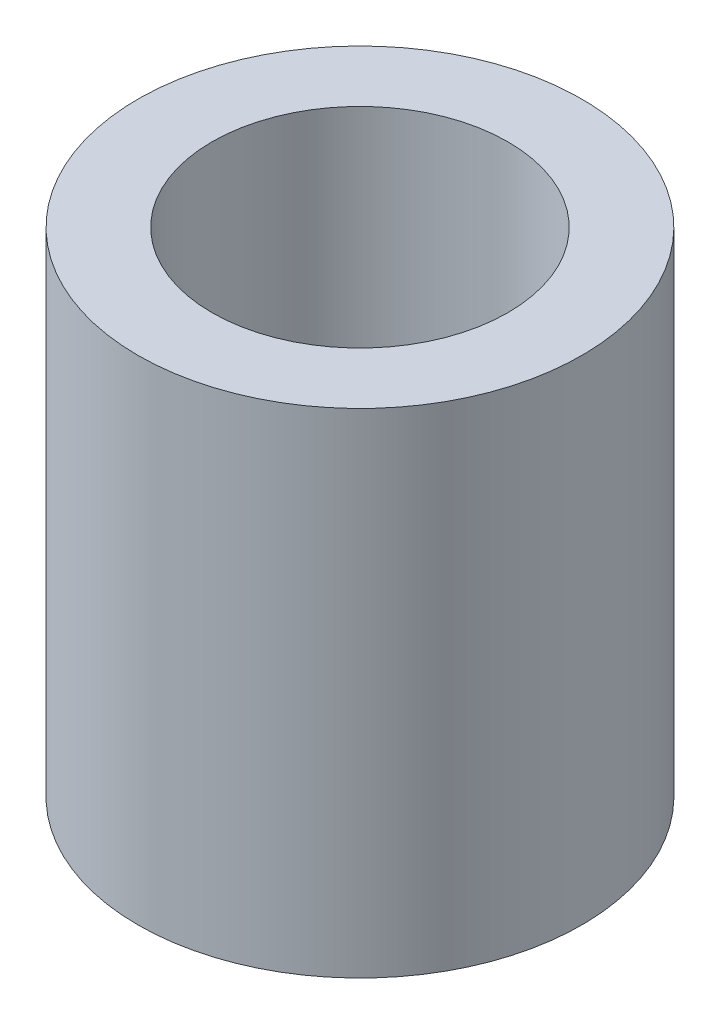
ISO-10303-21;
HEADER;
FILE_DESCRIPTION(('STEP AP214'),'2;1');
FILE_NAME('part.step','',(''),(''),'','','');
FILE_SCHEMA(('AUTOMOTIVE_DESIGN { 1 0 10303 214 1 1 1 1 }'));
ENDSEC;
DATA;
#1=APPLICATION_CONTEXT('core data for automotive mechanical design processes');
#2=APPLICATION_PROTOCOL_DEFINITION('international standard','automotive_design',2000,#1);
#3=PRODUCT_CONTEXT('',#1,'mechanical');
#4=PRODUCT('Part','Part','',(#3));
#5=PRODUCT_RELATED_PRODUCT_CATEGORY('part','',(#4));
#6=PRODUCT_DEFINITION_FORMATION('','',#4);
#7=PRODUCT_DEFINITION_CONTEXT('part definition',#1,'design');
#8=PRODUCT_DEFINITION('design','',#6,#7);
#9=PRODUCT_DEFINITION_SHAPE('','',#8);
#10=(LENGTH_UNIT() NAMED_UNIT(*) SI_UNIT(.MILLI.,.METRE.));
#11=(NAMED_UNIT(*) PLANE_ANGLE_UNIT() SI_UNIT($,.RADIAN.));
#12=(NAMED_UNIT(*) SI_UNIT($,.STERADIAN.) SOLID_ANGLE_UNIT());
#13=UNCERTAINTY_MEASURE_WITH_UNIT(LENGTH_MEASURE(1.E-05),#10,'distance_accuracy_value','');
#14=(GEOMETRIC_REPRESENTATION_CONTEXT(3) GLOBAL_UNCERTAINTY_ASSIGNED_CONTEXT((#13)) GLOBAL_UNIT_ASSIGNED_CONTEXT((#10,
#11,#12)) REPRESENTATION_CONTEXT('',''));
#15=CARTESIAN_POINT('',(0.,0.,0.));
#16=DIRECTION('',(0.,0.,1.));
#17=DIRECTION('',(1.,0.,0.));
#18=AXIS2_PLACEMENT_3D('',#15,#16,#17);
#19=CARTESIAN_POINT('',(0.,5.,0.));
#20=DIRECTION('',(0.,1.,0.));
#21=DIRECTION('',(0.,0.,1.));
#22=AXIS2_PLACEMENT_3D('',#19,#20,#21);
#23=PLANE('',#22);
#24=CARTESIAN_POINT('',(0.,5.,0.));
#25=DIRECTION('',(0.,1.,0.));
#26=DIRECTION('',(0.,0.,1.));
#27=AXIS2_PLACEMENT_3D('',#24,#25,#26);
#28=CIRCLE('',#27,2.25);
#29=CARTESIAN_POINT('',(0.,5.,2.25));
#30=VERTEX_POINT('',#29);
#31=EDGE_CURVE('E10',#30,#30,#28,.T.);
#32=ORIENTED_EDGE('',*,*,#31,.T.);
#33=EDGE_LOOP('',(#32));
#34=FACE_BOUND('',#33,.T.);
#35=CARTESIAN_POINT('',(0.,5.,0.));
#36=DIRECTION('',(0.,1.,0.));
#37=DIRECTION('',(0.,0.,1.));
#38=AXIS2_PLACEMENT_3D('',#35,#36,#37);
#39=CIRCLE('',#38,1.5);
#40=CARTESIAN_POINT('',(0.,5.,1.5));
#41=VERTEX_POINT('',#40);
#42=EDGE_CURVE('E50',#41,#41,#39,.T.);
#43=ORIENTED_EDGE('',*,*,#42,.F.);
#44=EDGE_LOOP('',(#43));
#45=FACE_BOUND('',#44,.T.);
#46=ADVANCED_FACE('F39',(#34,#45),#23,.T.);
#47=CARTESIAN_POINT('',(0.,0.,0.));
#48=DIRECTION('',(0.,1.,0.));
#49=DIRECTION('',(0.,0.,1.));
#50=AXIS2_PLACEMENT_3D('',#47,#48,#49);
#51=PLANE('',#50);
#52=CARTESIAN_POINT('',(0.,0.,0.));
#53=DIRECTION('',(0.,1.,0.));
#54=DIRECTION('',(0.,0.,1.));
#55=AXIS2_PLACEMENT_3D('',#52,#53,#54);
#56=CIRCLE('',#55,2.25);
#57=CARTESIAN_POINT('',(0.,0.,2.25));
#58=VERTEX_POINT('',#57);
#59=EDGE_CURVE('E43',#58,#58,#56,.T.);
#60=ORIENTED_EDGE('',*,*,#59,.F.);
#61=EDGE_LOOP('',(#60));
#62=FACE_BOUND('',#61,.T.);
#63=CARTESIAN_POINT('',(0.,0.,0.));
#64=DIRECTION('',(0.,1.,0.));
#65=DIRECTION('',(0.,0.,1.));
#66=AXIS2_PLACEMENT_3D('',#63,#64,#65);
#67=CIRCLE('',#66,1.5);
#68=CARTESIAN_POINT('',(0.,0.,1.5));
#69=VERTEX_POINT('',#68);
#70=EDGE_CURVE('E52',#69,#69,#67,.T.);
#71=ORIENTED_EDGE('',*,*,#70,.T.);
#72=EDGE_LOOP('',(#71));
#73=FACE_BOUND('',#72,.T.);
#74=ADVANCED_FACE('F62',(#62,#73),#51,.F.);
#75=CARTESIAN_POINT('',(0.,5.,0.));
#76=DIRECTION('',(0.,-1.,0.));
#77=DIRECTION('',(0.,0.,-1.));
#78=AXIS2_PLACEMENT_3D('',#75,#76,#77);
#79=CYLINDRICAL_SURFACE('',#78,2.25);
#80=ORIENTED_EDGE('',*,*,#31,.F.);
#81=EDGE_LOOP('',(#80));
#82=FACE_BOUND('',#81,.T.);
#83=ORIENTED_EDGE('',*,*,#59,.T.);
#84=EDGE_LOOP('',(#83));
#85=FACE_BOUND('',#84,.T.);
#86=ADVANCED_FACE('F41',(#82,#85),#79,.T.);
#87=CARTESIAN_POINT('',(0.,5.,0.));
#88=DIRECTION('',(0.,-1.,0.));
#89=DIRECTION('',(0.,0.,-1.));
#90=AXIS2_PLACEMENT_3D('',#87,#88,#89);
#91=CYLINDRICAL_SURFACE('',#90,1.5);
#92=ORIENTED_EDGE('',*,*,#42,.T.);
#93=EDGE_LOOP('',(#92));
#94=FACE_BOUND('',#93,.T.);
#95=ORIENTED_EDGE('',*,*,#70,.F.);
#96=EDGE_LOOP('',(#95));
#97=FACE_BOUND('',#96,.T.);
#98=ADVANCED_FACE('F58',(#94,#97),#91,.F.);
#99=CLOSED_SHELL('',(#46,#74,#86,#98));
#100=MANIFOLD_SOLID_BREP('B2',#99);
#101=ADVANCED_BREP_SHAPE_REPRESENTATION('',(#18,#100),#14);
#102=SHAPE_DEFINITION_REPRESENTATION(#9,#101);
ENDSEC;
END-ISO-10303-21;
